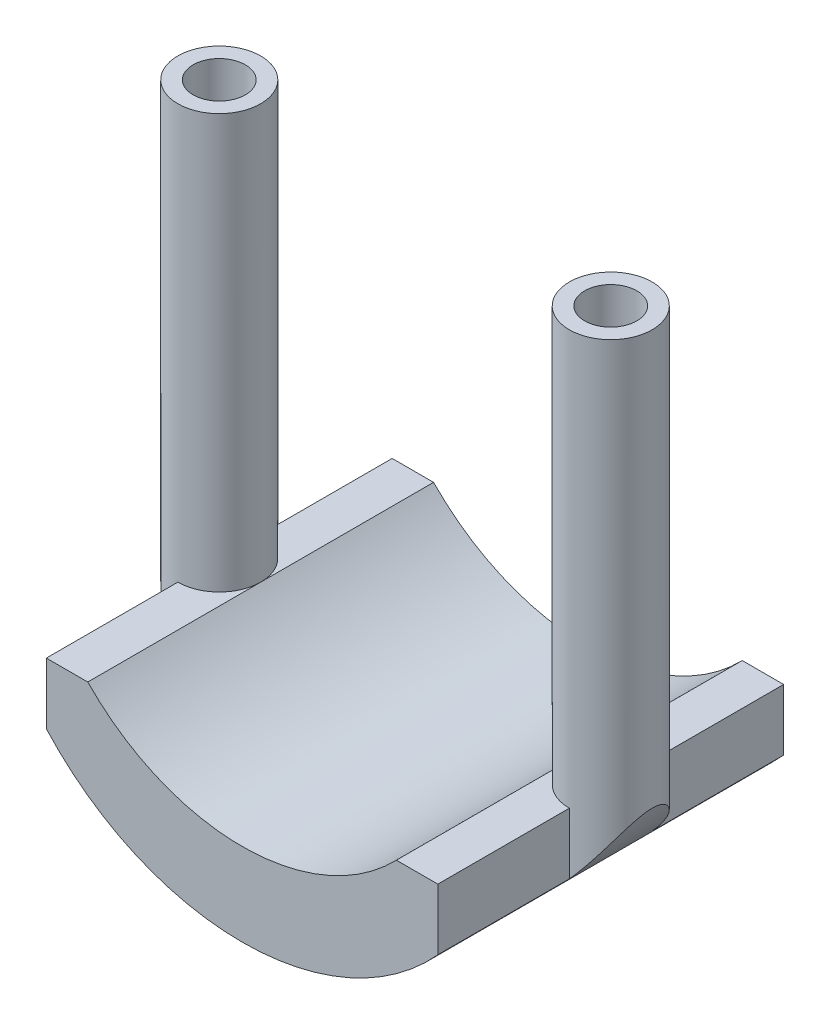
ISO-10303-21;
HEADER;
FILE_DESCRIPTION(('STEP AP214'),'2;1');
FILE_NAME('part.step','',(''),(''),'','','');
FILE_SCHEMA(('AUTOMOTIVE_DESIGN { 1 0 10303 214 1 1 1 1 }'));
ENDSEC;
DATA;
#1=APPLICATION_CONTEXT('core data for automotive mechanical design processes');
#2=APPLICATION_PROTOCOL_DEFINITION('international standard','automotive_design',2000,#1);
#3=PRODUCT_CONTEXT('',#1,'mechanical');
#4=PRODUCT('Part','Part','',(#3));
#5=PRODUCT_RELATED_PRODUCT_CATEGORY('part','',(#4));
#6=PRODUCT_DEFINITION_FORMATION('','',#4);
#7=PRODUCT_DEFINITION_CONTEXT('part definition',#1,'design');
#8=PRODUCT_DEFINITION('design','',#6,#7);
#9=PRODUCT_DEFINITION_SHAPE('','',#8);
#10=(LENGTH_UNIT() NAMED_UNIT(*) SI_UNIT(.MILLI.,.METRE.));
#11=(NAMED_UNIT(*) PLANE_ANGLE_UNIT() SI_UNIT($,.RADIAN.));
#12=(NAMED_UNIT(*) SI_UNIT($,.STERADIAN.) SOLID_ANGLE_UNIT());
#13=UNCERTAINTY_MEASURE_WITH_UNIT(LENGTH_MEASURE(1.E-05),#10,'distance_accuracy_value','');
#14=(GEOMETRIC_REPRESENTATION_CONTEXT(3) GLOBAL_UNCERTAINTY_ASSIGNED_CONTEXT((#13)) GLOBAL_UNIT_ASSIGNED_CONTEXT((#10,
#11,#12)) REPRESENTATION_CONTEXT('',''));
#15=CARTESIAN_POINT('',(0.,0.,0.));
#16=DIRECTION('',(0.,0.,1.));
#17=DIRECTION('',(1.,0.,0.));
#18=AXIS2_PLACEMENT_3D('',#15,#16,#17);
#19=CARTESIAN_POINT('',(-15.,0.,0.));
#20=DIRECTION('',(0.,-1.,0.));
#21=DIRECTION('',(0.,0.,-1.));
#22=AXIS2_PLACEMENT_3D('',#19,#20,#21);
#23=PLANE('',#22);
#24=DIRECTION('',(1.,0.,0.));
#25=VECTOR('',#24,1.);
#26=CARTESIAN_POINT('',(15.,0.,-13.25));
#27=LINE('',#26,#25);
#28=CARTESIAN_POINT('',(11.825,0.,-13.25));
#29=VERTEX_POINT('',#28);
#30=CARTESIAN_POINT('',(15.,0.,-13.25));
#31=VERTEX_POINT('',#30);
#32=EDGE_CURVE('E141',#29,#31,#27,.T.);
#33=ORIENTED_EDGE('',*,*,#32,.F.);
#34=DIRECTION('',(0.,0.,1.));
#35=VECTOR('',#34,1.);
#36=CARTESIAN_POINT('',(11.825,0.,-13.250025));
#37=LINE('',#36,#35);
#38=CARTESIAN_POINT('',(11.825,0.,0.));
#39=VERTEX_POINT('',#38);
#40=EDGE_CURVE('E12',#29,#39,#37,.T.);
#41=ORIENTED_EDGE('',*,*,#40,.T.);
#42=CARTESIAN_POINT('',(15.,0.,0.));
#43=DIRECTION('',(0.,-1.,0.));
#44=DIRECTION('',(0.,0.,-1.));
#45=AXIS2_PLACEMENT_3D('',#42,#43,#44);
#46=CIRCLE('',#45,3.175);
#47=CARTESIAN_POINT('',(15.,0.,-3.17500000000001));
#48=VERTEX_POINT('',#47);
#49=EDGE_CURVE('E227',#48,#39,#46,.F.);
#50=ORIENTED_EDGE('',*,*,#49,.F.);
#51=DIRECTION('',(0.,0.,1.));
#52=VECTOR('',#51,1.);
#53=CARTESIAN_POINT('',(15.,0.,-3.17500000000001));
#54=LINE('',#53,#52);
#55=EDGE_CURVE('E149',#31,#48,#54,.T.);
#56=ORIENTED_EDGE('',*,*,#55,.F.);
#57=EDGE_LOOP('',(#33,#41,#50,#56));
#58=FACE_BOUND('',#57,.T.);
#59=ADVANCED_FACE('F51',(#58),#23,.F.);
#60=CARTESIAN_POINT('',(15.,0.,3.175));
#61=VERTEX_POINT('',#60);
#62=EDGE_CURVE('E186',#39,#61,#46,.F.);
#63=ORIENTED_EDGE('',*,*,#62,.F.);
#64=CARTESIAN_POINT('',(11.825,0.,13.25));
#65=VERTEX_POINT('',#64);
#66=EDGE_CURVE('E62',#39,#65,#37,.T.);
#67=ORIENTED_EDGE('',*,*,#66,.T.);
#68=DIRECTION('',(-1.,0.,0.));
#69=VECTOR('',#68,1.);
#70=CARTESIAN_POINT('',(15.,0.,13.25));
#71=LINE('',#70,#69);
#72=CARTESIAN_POINT('',(15.,0.,13.25));
#73=VERTEX_POINT('',#72);
#74=EDGE_CURVE('E163',#73,#65,#71,.T.);
#75=ORIENTED_EDGE('',*,*,#74,.F.);
#76=DIRECTION('',(0.,0.,1.));
#77=VECTOR('',#76,1.);
#78=CARTESIAN_POINT('',(15.,0.,3.175));
#79=LINE('',#78,#77);
#80=EDGE_CURVE('E159',#61,#73,#79,.T.);
#81=ORIENTED_EDGE('',*,*,#80,.F.);
#82=EDGE_LOOP('',(#63,#67,#75,#81));
#83=FACE_BOUND('',#82,.T.);
#84=ADVANCED_FACE('F209',(#83),#23,.F.);
#85=CARTESIAN_POINT('',(-11.825,0.,13.25));
#86=VERTEX_POINT('',#85);
#87=CARTESIAN_POINT('',(-15.,0.,13.25));
#88=VERTEX_POINT('',#87);
#89=EDGE_CURVE('E162',#86,#88,#71,.T.);
#90=ORIENTED_EDGE('',*,*,#89,.F.);
#91=DIRECTION('',(0.,0.,1.));
#92=VECTOR('',#91,1.);
#93=CARTESIAN_POINT('',(-11.825,0.,-13.250025));
#94=LINE('',#93,#92);
#95=CARTESIAN_POINT('',(-11.825,0.,0.));
#96=VERTEX_POINT('',#95);
#97=EDGE_CURVE('E129',#86,#96,#94,.F.);
#98=ORIENTED_EDGE('',*,*,#97,.T.);
#99=CARTESIAN_POINT('',(-15.,0.,0.));
#100=DIRECTION('',(0.,1.,0.));
#101=DIRECTION('',(0.,0.,1.));
#102=AXIS2_PLACEMENT_3D('',#99,#100,#101);
#103=CIRCLE('',#102,3.175);
#104=CARTESIAN_POINT('',(-15.,0.,3.175));
#105=VERTEX_POINT('',#104);
#106=EDGE_CURVE('E187',#105,#96,#103,.T.);
#107=ORIENTED_EDGE('',*,*,#106,.F.);
#108=DIRECTION('',(0.,0.,-1.));
#109=VECTOR('',#108,1.);
#110=CARTESIAN_POINT('',(-15.,0.,3.175));
#111=LINE('',#110,#109);
#112=EDGE_CURVE('E166',#88,#105,#111,.T.);
#113=ORIENTED_EDGE('',*,*,#112,.F.);
#114=EDGE_LOOP('',(#90,#98,#107,#113));
#115=FACE_BOUND('',#114,.T.);
#116=ADVANCED_FACE('F296',(#115),#23,.F.);
#117=CARTESIAN_POINT('',(-15.,31.75,0.));
#118=DIRECTION('',(0.,-1.,0.));
#119=DIRECTION('',(0.,0.,-1.));
#120=AXIS2_PLACEMENT_3D('',#117,#118,#119);
#121=CYLINDRICAL_SURFACE('',#120,3.175);
#122=CARTESIAN_POINT('',(-15.,31.75,0.));
#123=DIRECTION('',(0.,1.,0.));
#124=DIRECTION('',(0.,0.,1.));
#125=AXIS2_PLACEMENT_3D('',#122,#123,#124);
#126=CIRCLE('',#125,3.175);
#127=CARTESIAN_POINT('',(-15.,31.75,3.175));
#128=VERTEX_POINT('',#127);
#129=EDGE_CURVE('E183',#128,#128,#126,.T.);
#130=ORIENTED_EDGE('',*,*,#129,.F.);
#131=EDGE_LOOP('',(#130));
#132=FACE_BOUND('',#131,.T.);
#133=CARTESIAN_POINT('',(-15.,-4.69251218639161,-3.175));
#134=CARTESIAN_POINT('',(-14.8205033811229,-4.89092476869645,-3.17500426324024));
#135=CARTESIAN_POINT('',(-14.6369237073661,-5.08590920938369,-3.15981877218464));
#136=CARTESIAN_POINT('',(-14.2649875373379,-5.46567546884102,-3.09451581072287));
#137=CARTESIAN_POINT('',(-14.0766289421228,-5.6504526872134,-3.04438272584182));
#138=CARTESIAN_POINT('',(-13.7279860773095,-5.9797490289322,-2.91410960622013));
#139=CARTESIAN_POINT('',(-13.5675765249512,-6.12622800863299,-2.83934980518906));
#140=CARTESIAN_POINT('',(-13.2529145670275,-6.404880166803,-2.6573058387837));
#141=CARTESIAN_POINT('',(-13.0986537078819,-6.53707344669857,-2.55006820332544));
#142=CARTESIAN_POINT('',(-12.8317513137313,-6.7595606963644,-2.32458781779786));
#143=CARTESIAN_POINT('',(-12.7167765309544,-6.85304060280956,-2.21232434869968));
#144=CARTESIAN_POINT('',(-12.5548804443534,-6.9821109527208,-2.027009530444));
#145=CARTESIAN_POINT('',(-12.5026532417396,-7.02329348540627,-1.96238238996577));
#146=CARTESIAN_POINT('',(-12.4024265540511,-7.1015938282898,-1.82764242802179));
#147=CARTESIAN_POINT('',(-12.3544251428567,-7.13871349224414,-1.75753213358982));
#148=CARTESIAN_POINT('',(-12.2629417638018,-7.20887048923795,-1.61140859624324));
#149=CARTESIAN_POINT('',(-12.2195061825062,-7.24186646614424,-1.53534634647773));
#150=CARTESIAN_POINT('',(-12.1384435315487,-7.30299922696252,-1.37837439780977));
#151=CARTESIAN_POINT('',(-12.1008133149241,-7.33113864449968,-1.29746735841784));
#152=CARTESIAN_POINT('',(-12.0320664757083,-7.38223799204299,-1.13140078348071));
#153=CARTESIAN_POINT('',(-12.0009468591754,-7.40520030315416,-1.04624322497778));
#154=CARTESIAN_POINT('',(-11.945846091496,-7.44566949537515,-0.872398070225833));
#155=CARTESIAN_POINT('',(-11.9218635533182,-7.46317743652713,-0.78371116367929));
#156=CARTESIAN_POINT('',(-11.8845421817276,-7.49033673552369,-0.617029782914338));
#157=CARTESIAN_POINT('',(-11.8701534457801,-7.50076733433465,-0.53939519740451));
#158=CARTESIAN_POINT('',(-11.8471667145353,-7.51740294750085,-0.382794605329069));
#159=CARTESIAN_POINT('',(-11.8385706496093,-7.52360655324478,-0.303828163907767));
#160=CARTESIAN_POINT('',(-11.8273337077117,-7.53171209312102,-0.145318138153976));
#161=CARTESIAN_POINT('',(-11.8246875813389,-7.53361781911112,-0.0657751247271536));
#162=CARTESIAN_POINT('',(-11.8253719864472,-7.5331241145751,0.0932799754835464));
#163=CARTESIAN_POINT('',(-11.8287046487468,-7.5307231491599,0.172792041135653));
#164=CARTESIAN_POINT('',(-11.8465723858494,-7.51783426402546,0.397018247582718));
#165=CARTESIAN_POINT('',(-11.8681181184742,-7.50228202991565,0.540973547893816));
#166=CARTESIAN_POINT('',(-11.9299715189903,-7.45728323858153,0.822407488534177));
#167=CARTESIAN_POINT('',(-11.9702781955919,-7.42783741546478,0.959886470636185));
#168=CARTESIAN_POINT('',(-12.0684834361971,-7.3552855312179,1.22783943484221));
#169=CARTESIAN_POINT('',(-12.1267152371879,-7.31191997935615,1.35812026041384));
#170=CARTESIAN_POINT('',(-12.2576236262407,-7.2130276233496,1.60614187670359));
#171=CARTESIAN_POINT('',(-12.3303043219782,-7.15749736044098,1.72387908674494));
#172=CARTESIAN_POINT('',(-12.4952932166363,-7.02932697225239,1.9569170193262));
#173=CARTESIAN_POINT('',(-12.5888598831978,-6.95550392285766,2.07067076308024));
#174=CARTESIAN_POINT('',(-12.7860005890668,-6.79673239386281,2.2802583795799));
#175=CARTESIAN_POINT('',(-12.8895811246299,-6.71177667934167,2.37608049969669));
#176=CARTESIAN_POINT('',(-13.1544595838743,-6.48965438464711,2.59153553302787));
#177=CARTESIAN_POINT('',(-13.3196812880768,-6.34694107425303,2.70065842301775));
#178=CARTESIAN_POINT('',(-13.6559414223191,-6.04607046543018,2.88285682505669));
#179=CARTESIAN_POINT('',(-13.8269908784351,-5.88788269547763,2.95585942706256));
#180=CARTESIAN_POINT('',(-14.1144221526229,-5.61233945122504,3.05146922752589));
#181=CARTESIAN_POINT('',(-14.2309229031751,-5.49796072151903,3.08271748716632));
#182=CARTESIAN_POINT('',(-14.4625588452152,-5.26488858576289,3.13142043063921));
#183=CARTESIAN_POINT('',(-14.5776935377711,-5.14619366394768,3.14887021880867));
#184=CARTESIAN_POINT('',(-14.8057106660033,-4.90524060674489,3.17112263365381));
#185=CARTESIAN_POINT('',(-14.9185898140847,-4.7829778303132,3.17590797066095));
#186=CARTESIAN_POINT('',(-15.1412247598072,-4.5357795895864,3.17381030787641));
#187=CARTESIAN_POINT('',(-15.2509806065437,-4.41084416735687,3.16692749160002));
#188=CARTESIAN_POINT('',(-15.5008752856459,-4.11923373794164,3.13849782067385));
#189=CARTESIAN_POINT('',(-15.6396957096708,-3.95180607196426,3.11301513444598));
#190=CARTESIAN_POINT('',(-15.9102628046364,-3.61467642308511,3.04491703578205));
#191=CARTESIAN_POINT('',(-16.0420064633575,-3.44497350953356,3.00229439222408));
#192=CARTESIAN_POINT('',(-16.2978563651724,-3.10452476896611,2.90088627166143));
#193=CARTESIAN_POINT('',(-16.4219588707244,-2.93377847578345,2.84209296071367));
#194=CARTESIAN_POINT('',(-16.6619380784916,-2.59274040987533,2.70877000035546));
#195=CARTESIAN_POINT('',(-16.777818485819,-2.42244846613229,2.63424749992075));
#196=CARTESIAN_POINT('',(-16.961819868065,-2.14324322049304,2.49800123741523));
#197=CARTESIAN_POINT('',(-17.0324635904153,-2.03370417671064,2.44092421325364));
#198=CARTESIAN_POINT('',(-17.1698703571187,-1.81616621523441,2.31963136312153));
#199=CARTESIAN_POINT('',(-17.236634170642,-1.70816699550488,2.25541695949912));
#200=CARTESIAN_POINT('',(-17.3658686670049,-1.49478141017556,2.11945077066519));
#201=CARTESIAN_POINT('',(-17.4283488510762,-1.38938961683399,2.04771662224494));
#202=CARTESIAN_POINT('',(-17.548738128669,-1.18221739723897,1.89577234298333));
#203=CARTESIAN_POINT('',(-17.6066497009302,-1.08043502939408,1.81556686435931));
#204=CARTESIAN_POINT('',(-17.719514319049,-0.878228260439077,1.64196045064789));
#205=CARTESIAN_POINT('',(-17.7742524291879,-0.778025963616148,1.54815654635292));
#206=CARTESIAN_POINT('',(-17.8768276528085,-0.586746248942451,1.348012285463));
#207=CARTESIAN_POINT('',(-17.9246670595403,-0.495665801918517,1.24167611627272));
#208=CARTESIAN_POINT('',(-18.000678509853,-0.348641139020262,1.04166500085582));
#209=CARTESIAN_POINT('',(-18.0308120115437,-0.289518658796541,0.951112713723735));
#210=CARTESIAN_POINT('',(-18.0840456222686,-0.18404440897729,0.760908415934263));
#211=CARTESIAN_POINT('',(-18.107161326205,-0.137664345414025,0.661277231025693));
#212=CARTESIAN_POINT('',(-18.1394432005674,-0.0724879765660675,0.480283409288171));
#213=CARTESIAN_POINT('',(-18.1506645378214,-0.0496716142670397,0.400758022979554));
#214=CARTESIAN_POINT('',(-18.1670676004247,-0.0162426867323507,0.238585926454408));
#215=CARTESIAN_POINT('',(-18.17225680337,-0.00561501229054437,0.155943212121486));
#216=CARTESIAN_POINT('',(-18.1760761173387,0.00220219981137142,-0.0104469158348688));
#217=CARTESIAN_POINT('',(-18.1746827553842,-0.000656353448610196,-0.0941972192502418));
#218=CARTESIAN_POINT('',(-18.16544000723,-0.0195522865256846,-0.259841463478308));
#219=CARTESIAN_POINT('',(-18.1575848940966,-0.0356013568493288,-0.341733691327889));
#220=CARTESIAN_POINT('',(-18.133653492111,-0.0842078295487032,-0.520344882541793));
#221=CARTESIAN_POINT('',(-18.1160804399877,-0.119755580327204,-0.6160330078488));
#222=CARTESIAN_POINT('',(-18.074052277734,-0.203890752980378,-0.799861466851044));
#223=CARTESIAN_POINT('',(-18.0495820061886,-0.252506890655784,-0.887984608181645));
#224=CARTESIAN_POINT('',(-18.0000627397135,-0.349696696452959,-1.04192103325311));
#225=CARTESIAN_POINT('',(-17.9758512854762,-0.396813309524851,-1.10895189638106));
#226=CARTESIAN_POINT('',(-17.9244331569286,-0.495809912626401,-1.23820457381986));
#227=CARTESIAN_POINT('',(-17.8972243980809,-0.547693213531406,-1.30042298937035));
#228=CARTESIAN_POINT('',(-17.8117324694039,-0.708855937807456,-1.48073084699326));
#229=CARTESIAN_POINT('',(-17.7496634858842,-0.823489610870968,-1.59223859568543));
#230=CARTESIAN_POINT('',(-17.620033122947,-1.05695755896059,-1.79728606175843));
#231=CARTESIAN_POINT('',(-17.552719928952,-1.17552918377591,-1.89129656479072));
#232=CARTESIAN_POINT('',(-17.4118838203927,-1.41754426300371,-2.06789648428308));
#233=CARTESIAN_POINT('',(-17.338355428152,-1.54099196274834,-2.15047565324453));
#234=CARTESIAN_POINT('',(-17.1856472740962,-1.79102523920031,-2.30552025789266));
#235=CARTESIAN_POINT('',(-17.1064581091932,-1.91761579768952,-2.37796824568908));
#236=CARTESIAN_POINT('',(-16.9429526002597,-2.17247915209529,-2.5133273814063));
#237=CARTESIAN_POINT('',(-16.8586379518092,-2.30075138079672,-2.57624165941052));
#238=CARTESIAN_POINT('',(-16.6766496670621,-2.57071074927785,-2.69863708579866));
#239=CARTESIAN_POINT('',(-16.5784755365202,-2.71248461247264,-2.75718293357318));
#240=CARTESIAN_POINT('',(-16.3765070671643,-2.99616466806827,-2.86336666702282));
#241=CARTESIAN_POINT('',(-16.2727114129249,-3.13807088373816,-2.91100198590087));
#242=CARTESIAN_POINT('',(-16.0601001796041,-3.42080740580612,-2.99496873756423));
#243=CARTESIAN_POINT('',(-15.9512996601377,-3.56163962157948,-3.03133182200759));
#244=CARTESIAN_POINT('',(-15.7287721570088,-3.84185970056326,-3.09238099734894));
#245=CARTESIAN_POINT('',(-15.6150474147963,-3.98124818587176,-3.1170723413453));
#246=CARTESIAN_POINT('',(-15.4179881678968,-4.21625160040424,-3.14843563002142));
#247=CARTESIAN_POINT('',(-15.3358081261236,-4.31241537437699,-3.15829421655108));
#248=CARTESIAN_POINT('',(-15.1693924718654,-4.50348118123944,-3.17157721664858));
#249=CARTESIAN_POINT('',(-15.0851557198618,-4.59838246750603,-3.17499797745889));
#250=CARTESIAN_POINT('',(-15.,-4.69251218639161,-3.175));
#251=B_SPLINE_CURVE_WITH_KNOTS('',3,(#133,#134,#135,#136,#137,#138,#139,#140,#141,#142,#143,
#144,#145,#146,#147,#148,#149,#150,#151,#152,#153,#154,#155,#156,#157,#158,#159,#160,#161,#162,
#163,#164,#165,#166,#167,#168,#169,#170,#171,#172,#173,#174,#175,#176,#177,#178,#179,#180,#181,
#182,#183,#184,#185,#186,#187,#188,#189,#190,#191,#192,#193,#194,#195,#196,#197,#198,#199,#200,
#201,#202,#203,#204,#205,#206,#207,#208,#209,#210,#211,#212,#213,#214,#215,#216,#217,#218,#219,
#220,#221,#222,#223,#224,#225,#226,#227,#228,#229,#230,#231,#232,#233,#234,#235,#236,#237,#238,
#239,#240,#241,#242,#243,#244,#245,#246,#247,#248,#249,#250),.UNSPECIFIED.,.T.,.F.,(4,2,2,2,2,2,
2,2,2,2,2,2,2,2,2,2,2,2,2,2,2,2,2,2,2,2,2,2,2,2,2,2,2,2,2,2,2,2,2,2,2,2,2,2,2,2,2,2,2,2,2,2,2,2,
2,2,2,2,4),(0.,0.802407373998286,1.60517349106174,2.29198612768376,2.9778194082931,
3.53311884003804,3.81103936161806,4.08883254370098,4.36921967461288,4.64945427557223,
4.92955972418818,5.20961070105196,5.44821826109419,5.68690529634162,5.92538166446762,
6.16394304158794,6.60086941387879,7.03777270249896,7.48334632921596,7.92904680965181,
8.4214324061908,8.9141395972197,9.64234455290856,10.3720134789014,10.8700776177538,
11.3683183893217,11.8672390154304,12.3661517946489,13.0222031118585,13.6785314993284,
14.3351784094106,14.9915275112103,15.4181996153673,15.844786843576,16.2703950387549,
16.6957707052929,17.1383810890498,17.5808440004908,17.916697398235,18.2517989079104,
18.5012725803997,18.7504366677055,19.0004899264488,19.2507650419654,19.5597766960571,
19.8694729868995,20.1254191516956,20.381544456937,20.8946676063151,21.3908928521297,
21.8875600923608,22.3850724261382,22.8824210623694,23.4283400634636,23.9743873651471,
24.5188872167513,25.0631417715148,25.4435993094566,25.8242726501731),.UNSPECIFIED.);
#252=CARTESIAN_POINT('',(-15.,-4.69251218639161,3.175));
#253=VERTEX_POINT('',#252);
#254=CARTESIAN_POINT('',(-15.,-4.69251218639161,-3.175));
#255=VERTEX_POINT('',#254);
#256=EDGE_CURVE('E237',#253,#255,#251,.T.);
#257=ORIENTED_EDGE('',*,*,#256,.F.);
#258=DIRECTION('',(0.,1.,0.));
#259=VECTOR('',#258,1.);
#260=CARTESIAN_POINT('',(-15.,-20.,3.175));
#261=LINE('',#260,#259);
#262=EDGE_CURVE('E171',#253,#105,#261,.T.);
#263=ORIENTED_EDGE('',*,*,#262,.T.);
#264=ORIENTED_EDGE('',*,*,#106,.T.);
#265=CARTESIAN_POINT('',(-15.,0.,-3.175));
#266=VERTEX_POINT('',#265);
#267=EDGE_CURVE('E190',#96,#266,#103,.T.);
#268=ORIENTED_EDGE('',*,*,#267,.T.);
#269=DIRECTION('',(0.,1.,0.));
#270=VECTOR('',#269,1.);
#271=CARTESIAN_POINT('',(-15.,-20.,-3.175));
#272=LINE('',#271,#270);
#273=EDGE_CURVE('E182',#255,#266,#272,.T.);
#274=ORIENTED_EDGE('',*,*,#273,.F.);
#275=EDGE_LOOP('',(#257,#263,#264,#268,#274));
#276=FACE_BOUND('',#275,.T.);
#277=ADVANCED_FACE('F53',(#132,#276),#121,.T.);
#278=CARTESIAN_POINT('',(-15.,-20.,-3.175));
#279=DIRECTION('',(1.,0.,0.));
#280=DIRECTION('',(0.,0.,-1.));
#281=AXIS2_PLACEMENT_3D('',#278,#279,#280);
#282=PLANE('',#281);
#283=DIRECTION('',(0.,0.,1.));
#284=VECTOR('',#283,1.);
#285=CARTESIAN_POINT('',(-15.,-4.69251218639162,-13.250025));
#286=LINE('',#285,#284);
#287=CARTESIAN_POINT('',(-15.,-4.69251218639162,-13.25));
#288=VERTEX_POINT('',#287);
#289=EDGE_CURVE('E247',#255,#288,#286,.F.);
#290=ORIENTED_EDGE('',*,*,#289,.F.);
#291=ORIENTED_EDGE('',*,*,#273,.T.);
#292=DIRECTION('',(0.,0.,-1.));
#293=VECTOR('',#292,1.);
#294=CARTESIAN_POINT('',(-15.,0.,-3.175));
#295=LINE('',#294,#293);
#296=CARTESIAN_POINT('',(-15.,0.,-13.25));
#297=VERTEX_POINT('',#296);
#298=EDGE_CURVE('E150',#266,#297,#295,.T.);
#299=ORIENTED_EDGE('',*,*,#298,.T.);
#300=DIRECTION('',(0.,1.,0.));
#301=VECTOR('',#300,1.);
#302=CARTESIAN_POINT('',(-15.,-20.,-13.25));
#303=LINE('',#302,#301);
#304=EDGE_CURVE('E180',#288,#297,#303,.T.);
#305=ORIENTED_EDGE('',*,*,#304,.F.);
#306=EDGE_LOOP('',(#290,#291,#299,#305));
#307=FACE_BOUND('',#306,.T.);
#308=ADVANCED_FACE('F283',(#307),#282,.F.);
#309=CARTESIAN_POINT('',(15.,-20.,-13.25));
#310=DIRECTION('',(0.,0.,1.));
#311=DIRECTION('',(1.,0.,0.));
#312=AXIS2_PLACEMENT_3D('',#309,#310,#311);
#313=PLANE('',#312);
#314=CARTESIAN_POINT('',(-11.825,0.,-13.25));
#315=VERTEX_POINT('',#314);
#316=EDGE_CURVE('E144',#297,#315,#27,.T.);
#317=ORIENTED_EDGE('',*,*,#316,.T.);
#318=CARTESIAN_POINT('',(0.,11.4830625,-13.25));
#319=DIRECTION('',(0.,0.,1.));
#320=DIRECTION('',(1.,0.,0.));
#321=AXIS2_PLACEMENT_3D('',#318,#319,#320);
#322=CIRCLE('',#321,16.4830625);
#323=EDGE_CURVE('E56',#315,#29,#322,.T.);
#324=ORIENTED_EDGE('',*,*,#323,.T.);
#325=ORIENTED_EDGE('',*,*,#32,.T.);
#326=DIRECTION('',(0.,1.,0.));
#327=VECTOR('',#326,1.);
#328=CARTESIAN_POINT('',(15.,-20.,-13.25));
#329=LINE('',#328,#327);
#330=CARTESIAN_POINT('',(15.,-4.69251218639162,-13.25));
#331=VERTEX_POINT('',#330);
#332=EDGE_CURVE('E178',#331,#31,#329,.T.);
#333=ORIENTED_EDGE('',*,*,#332,.F.);
#334=CARTESIAN_POINT('',(0.,8.87700991189428,-13.25));
#335=DIRECTION('',(0.,0.,1.));
#336=DIRECTION('',(1.,0.,0.));
#337=AXIS2_PLACEMENT_3D('',#334,#335,#336);
#338=CIRCLE('',#337,20.2270099118943);
#339=EDGE_CURVE('E249',#288,#331,#338,.T.);
#340=ORIENTED_EDGE('',*,*,#339,.F.);
#341=ORIENTED_EDGE('',*,*,#304,.T.);
#342=EDGE_LOOP('',(#317,#324,#325,#333,#340,#341));
#343=FACE_BOUND('',#342,.T.);
#344=ADVANCED_FACE('F139',(#343),#313,.F.);
#345=CARTESIAN_POINT('',(15.,-20.,-3.17500000000001));
#346=DIRECTION('',(-1.,0.,0.));
#347=DIRECTION('',(0.,0.,1.));
#348=AXIS2_PLACEMENT_3D('',#345,#346,#347);
#349=PLANE('',#348);
#350=DIRECTION('',(0.,0.,1.));
#351=VECTOR('',#350,1.);
#352=CARTESIAN_POINT('',(15.,-4.69251218639162,-13.250025));
#353=LINE('',#352,#351);
#354=CARTESIAN_POINT('',(15.,-4.69251218639162,-3.17500000000001));
#355=VERTEX_POINT('',#354);
#356=EDGE_CURVE('E270',#331,#355,#353,.T.);
#357=ORIENTED_EDGE('',*,*,#356,.F.);
#358=ORIENTED_EDGE('',*,*,#332,.T.);
#359=ORIENTED_EDGE('',*,*,#55,.T.);
#360=DIRECTION('',(0.,1.,0.));
#361=VECTOR('',#360,1.);
#362=CARTESIAN_POINT('',(15.,-20.,-3.17500000000001));
#363=LINE('',#362,#361);
#364=EDGE_CURVE('E176',#355,#48,#363,.T.);
#365=ORIENTED_EDGE('',*,*,#364,.F.);
#366=EDGE_LOOP('',(#357,#358,#359,#365));
#367=FACE_BOUND('',#366,.T.);
#368=ADVANCED_FACE('F275',(#367),#349,.F.);
#369=CARTESIAN_POINT('',(15.,-20.,0.));
#370=DIRECTION('',(0.,1.,0.));
#371=DIRECTION('',(0.,0.,1.));
#372=AXIS2_PLACEMENT_3D('',#369,#370,#371);
#373=CYLINDRICAL_SURFACE('',#372,3.175);
#374=CARTESIAN_POINT('',(15.,31.75,0.));
#375=DIRECTION('',(0.,1.,0.));
#376=DIRECTION('',(0.,0.,1.));
#377=AXIS2_PLACEMENT_3D('',#374,#375,#376);
#378=CIRCLE('',#377,3.175);
#379=CARTESIAN_POINT('',(15.,31.75,3.175));
#380=VERTEX_POINT('',#379);
#381=EDGE_CURVE('E153',#380,#380,#378,.T.);
#382=ORIENTED_EDGE('',*,*,#381,.F.);
#383=EDGE_LOOP('',(#382));
#384=FACE_BOUND('',#383,.T.);
#385=CARTESIAN_POINT('',(15.,-4.69251218639162,3.175));
#386=CARTESIAN_POINT('',(14.8205033811229,-4.89092476869646,3.17500426324023));
#387=CARTESIAN_POINT('',(14.6369237073661,-5.0859092093837,3.15981877218464));
#388=CARTESIAN_POINT('',(14.2649875373379,-5.46567546884103,3.09451581072286));
#389=CARTESIAN_POINT('',(14.0766289421228,-5.65045268721341,3.04438272584182));
#390=CARTESIAN_POINT('',(13.7279860773095,-5.97974902893221,2.91410960622013));
#391=CARTESIAN_POINT('',(13.5675765249512,-6.126228008633,2.83934980518906));
#392=CARTESIAN_POINT('',(13.2529145670275,-6.40488016680301,2.65730583878369));
#393=CARTESIAN_POINT('',(13.0986537078819,-6.53707344669858,2.55006820332544));
#394=CARTESIAN_POINT('',(12.8317513137313,-6.75956069636441,2.32458781779785));
#395=CARTESIAN_POINT('',(12.7167765309544,-6.85304060280957,2.21232434869967));
#396=CARTESIAN_POINT('',(12.5548804443534,-6.98211095272081,2.02700953044399));
#397=CARTESIAN_POINT('',(12.5026532417396,-7.02329348540628,1.96238238996576));
#398=CARTESIAN_POINT('',(12.4024265540511,-7.10159382828981,1.82764242802178));
#399=CARTESIAN_POINT('',(12.3544251428567,-7.13871349224415,1.75753213358981));
#400=CARTESIAN_POINT('',(12.2629417638018,-7.20887048923796,1.61140859624323));
#401=CARTESIAN_POINT('',(12.2195061825062,-7.24186646614425,1.53534634647772));
#402=CARTESIAN_POINT('',(12.1384435315487,-7.30299922696253,1.37837439780976));
#403=CARTESIAN_POINT('',(12.1008133149241,-7.33113864449969,1.29746735841783));
#404=CARTESIAN_POINT('',(12.0320664757083,-7.382237992043,1.1314007834807));
#405=CARTESIAN_POINT('',(12.0009468591754,-7.40520030315418,1.04624322497777));
#406=CARTESIAN_POINT('',(11.945846091496,-7.44566949537516,0.872398070225823));
#407=CARTESIAN_POINT('',(11.9218635533182,-7.46317743652715,0.78371116367928));
#408=CARTESIAN_POINT('',(11.8845421817276,-7.49033673552369,0.617029782914327));
#409=CARTESIAN_POINT('',(11.8701534457801,-7.50076733433465,0.539395197404498));
#410=CARTESIAN_POINT('',(11.8471667145353,-7.51740294750085,0.382794605329057));
#411=CARTESIAN_POINT('',(11.8385706496094,-7.52360655324479,0.303828163907755));
#412=CARTESIAN_POINT('',(11.8273337077117,-7.53171209312103,0.145318138153964));
#413=CARTESIAN_POINT('',(11.8246875813389,-7.53361781911113,0.0657751247271415));
#414=CARTESIAN_POINT('',(11.8253719864472,-7.53312411457511,-0.0932799754835585));
#415=CARTESIAN_POINT('',(11.8287046487468,-7.5307231491599,-0.172792041135665));
#416=CARTESIAN_POINT('',(11.8465723858494,-7.51783426402546,-0.397018247582731));
#417=CARTESIAN_POINT('',(11.8681181184742,-7.50228202991565,-0.540973547893829));
#418=CARTESIAN_POINT('',(11.9299715189903,-7.45728323858154,-0.82240748853419));
#419=CARTESIAN_POINT('',(11.9702781955919,-7.42783741546478,-0.959886470636197));
#420=CARTESIAN_POINT('',(12.0684834361971,-7.3552855312179,-1.22783943484223));
#421=CARTESIAN_POINT('',(12.1267152371879,-7.31191997935616,-1.35812026041385));
#422=CARTESIAN_POINT('',(12.2576236262407,-7.2130276233496,-1.60614187670361));
#423=CARTESIAN_POINT('',(12.3303043219782,-7.15749736044099,-1.72387908674495));
#424=CARTESIAN_POINT('',(12.4952932166363,-7.0293269722524,-1.95691701932621));
#425=CARTESIAN_POINT('',(12.5888598831979,-6.95550392285766,-2.07067076308025));
#426=CARTESIAN_POINT('',(12.7860005890668,-6.79673239386281,-2.28025837957991));
#427=CARTESIAN_POINT('',(12.8895811246299,-6.71177667934167,-2.3760804996967));
#428=CARTESIAN_POINT('',(13.1544595838743,-6.48965438464711,-2.59153553302788));
#429=CARTESIAN_POINT('',(13.3196812880768,-6.34694107425303,-2.70065842301776));
#430=CARTESIAN_POINT('',(13.6559414223191,-6.04607046543019,-2.8828568250567));
#431=CARTESIAN_POINT('',(13.8269908784351,-5.88788269547764,-2.95585942706257));
#432=CARTESIAN_POINT('',(14.1144221526229,-5.61233945122505,-3.05146922752589));
#433=CARTESIAN_POINT('',(14.2309229031751,-5.49796072151903,-3.08271748716633));
#434=CARTESIAN_POINT('',(14.4625588452152,-5.26488858576289,-3.13142043063921));
#435=CARTESIAN_POINT('',(14.5776935377711,-5.14619366394768,-3.14887021880868));
#436=CARTESIAN_POINT('',(14.8057106660034,-4.9052406067449,-3.17112263365381));
#437=CARTESIAN_POINT('',(14.9185898140847,-4.7829778303132,-3.17590797066096));
#438=CARTESIAN_POINT('',(15.1412247598072,-4.53577958958641,-3.17381030787642));
#439=CARTESIAN_POINT('',(15.2509806065437,-4.41084416735688,-3.16692749160003));
#440=CARTESIAN_POINT('',(15.5008752856459,-4.11923373794165,-3.13849782067386));
#441=CARTESIAN_POINT('',(15.6396957096708,-3.95180607196427,-3.11301513444599));
#442=CARTESIAN_POINT('',(15.9102628046364,-3.61467642308512,-3.04491703578205));
#443=CARTESIAN_POINT('',(16.0420064633575,-3.44497350953357,-3.00229439222408));
#444=CARTESIAN_POINT('',(16.2978563651724,-3.10452476896612,-2.90088627166143));
#445=CARTESIAN_POINT('',(16.4219588707244,-2.93377847578347,-2.84209296071367));
#446=CARTESIAN_POINT('',(16.6619380784916,-2.59274040987535,-2.70877000035546));
#447=CARTESIAN_POINT('',(16.777818485819,-2.4224484661323,-2.63424749992076));
#448=CARTESIAN_POINT('',(16.961819868065,-2.14324322049306,-2.49800123741524));
#449=CARTESIAN_POINT('',(17.0324635904153,-2.03370417671066,-2.44092421325364));
#450=CARTESIAN_POINT('',(17.1698703571187,-1.81616621523442,-2.31963136312153));
#451=CARTESIAN_POINT('',(17.236634170642,-1.7081669955049,-2.25541695949913));
#452=CARTESIAN_POINT('',(17.3658686670049,-1.49478141017558,-2.1194507706652));
#453=CARTESIAN_POINT('',(17.4283488510762,-1.38938961683401,-2.04771662224494));
#454=CARTESIAN_POINT('',(17.548738128669,-1.182217397239,-1.89577234298333));
#455=CARTESIAN_POINT('',(17.6066497009302,-1.0804350293941,-1.81556686435932));
#456=CARTESIAN_POINT('',(17.719514319049,-0.878228260439095,-1.64196045064789));
#457=CARTESIAN_POINT('',(17.774252429188,-0.778025963616165,-1.54815654635292));
#458=CARTESIAN_POINT('',(17.8768276528085,-0.586746248942469,-1.34801228546299));
#459=CARTESIAN_POINT('',(17.9246670595403,-0.495665801918537,-1.24167611627272));
#460=CARTESIAN_POINT('',(18.000678509853,-0.348641139020279,-1.04166500085582));
#461=CARTESIAN_POINT('',(18.0308120115437,-0.289518658796555,-0.951112713723737));
#462=CARTESIAN_POINT('',(18.0840456222686,-0.184044408977307,-0.760908415934264));
#463=CARTESIAN_POINT('',(18.107161326205,-0.137664345414049,-0.661277231025691));
#464=CARTESIAN_POINT('',(18.1394432005674,-0.0724879765660939,-0.480283409288167));
#465=CARTESIAN_POINT('',(18.1506645378214,-0.0496716142670638,-0.400758022979552));
#466=CARTESIAN_POINT('',(18.1670676004247,-0.0162426867323735,-0.238585926454406));
#467=CARTESIAN_POINT('',(18.17225680337,-0.00561501229056824,-0.155943212121484));
#468=CARTESIAN_POINT('',(18.1760761173387,0.0022021998113456,0.0104469158348715));
#469=CARTESIAN_POINT('',(18.1746827553842,-0.000656353448636949,0.0941972192502447));
#470=CARTESIAN_POINT('',(18.16544000723,-0.0195522865257097,0.259841463478311));
#471=CARTESIAN_POINT('',(18.1575848940966,-0.0356013568493511,0.341733691327892));
#472=CARTESIAN_POINT('',(18.133653492111,-0.0842078295487261,0.520344882541794));
#473=CARTESIAN_POINT('',(18.1160804399877,-0.119755580327232,0.616033007848798));
#474=CARTESIAN_POINT('',(18.074052277734,-0.20389075298041,0.799861466851044));
#475=CARTESIAN_POINT('',(18.0495820061886,-0.252506890655813,0.887984608181648));
#476=CARTESIAN_POINT('',(18.0000627397135,-0.34969669645299,1.04192103325311));
#477=CARTESIAN_POINT('',(17.9758512854761,-0.396813309524882,1.10895189638107));
#478=CARTESIAN_POINT('',(17.9244331569286,-0.495809912626436,1.23820457381987));
#479=CARTESIAN_POINT('',(17.8972243980809,-0.547693213531443,1.30042298937036));
#480=CARTESIAN_POINT('',(17.8117324694039,-0.708855937807495,1.48073084699327));
#481=CARTESIAN_POINT('',(17.7496634858842,-0.823489610871003,1.59223859568544));
#482=CARTESIAN_POINT('',(17.620033122947,-1.05695755896063,1.79728606175844));
#483=CARTESIAN_POINT('',(17.552719928952,-1.17552918377595,1.89129656479073));
#484=CARTESIAN_POINT('',(17.4118838203927,-1.41754426300376,2.06789648428309));
#485=CARTESIAN_POINT('',(17.338355428152,-1.54099196274838,2.15047565324454));
#486=CARTESIAN_POINT('',(17.1856472740962,-1.79102523920036,2.30552025789268));
#487=CARTESIAN_POINT('',(17.1064581091932,-1.91761579768956,2.37796824568909));
#488=CARTESIAN_POINT('',(16.9429526002597,-2.17247915209534,2.51332738140631));
#489=CARTESIAN_POINT('',(16.8586379518092,-2.30075138079677,2.57624165941053));
#490=CARTESIAN_POINT('',(16.6766496670621,-2.5707107492779,2.69863708579867));
#491=CARTESIAN_POINT('',(16.5784755365201,-2.71248461247269,2.75718293357319));
#492=CARTESIAN_POINT('',(16.3765070671643,-2.99616466806832,2.86336666702283));
#493=CARTESIAN_POINT('',(16.2727114129248,-3.13807088373822,2.91100198590088));
#494=CARTESIAN_POINT('',(16.0601001796041,-3.42080740580618,2.99496873756423));
#495=CARTESIAN_POINT('',(15.9512996601376,-3.56163962157954,3.03133182200759));
#496=CARTESIAN_POINT('',(15.7287721570087,-3.84185970056332,3.09238099734894));
#497=CARTESIAN_POINT('',(15.6150474147963,-3.98124818587182,3.1170723413453));
#498=CARTESIAN_POINT('',(15.4179881678968,-4.21625160040429,3.14843563002142));
#499=CARTESIAN_POINT('',(15.3358081261236,-4.31241537437703,3.15829421655107));
#500=CARTESIAN_POINT('',(15.1693924718654,-4.50348118123946,3.17157721664858));
#501=CARTESIAN_POINT('',(15.0851557198618,-4.59838246750605,3.17499797745888));
#502=CARTESIAN_POINT('',(15.,-4.69251218639162,3.175));
#503=B_SPLINE_CURVE_WITH_KNOTS('',3,(#385,#386,#387,#388,#389,#390,#391,#392,#393,#394,#395,
#396,#397,#398,#399,#400,#401,#402,#403,#404,#405,#406,#407,#408,#409,#410,#411,#412,#413,#414,
#415,#416,#417,#418,#419,#420,#421,#422,#423,#424,#425,#426,#427,#428,#429,#430,#431,#432,#433,
#434,#435,#436,#437,#438,#439,#440,#441,#442,#443,#444,#445,#446,#447,#448,#449,#450,#451,#452,
#453,#454,#455,#456,#457,#458,#459,#460,#461,#462,#463,#464,#465,#466,#467,#468,#469,#470,#471,
#472,#473,#474,#475,#476,#477,#478,#479,#480,#481,#482,#483,#484,#485,#486,#487,#488,#489,#490,
#491,#492,#493,#494,#495,#496,#497,#498,#499,#500,#501,#502),.UNSPECIFIED.,.T.,.F.,(4,2,2,2,2,2,
2,2,2,2,2,2,2,2,2,2,2,2,2,2,2,2,2,2,2,2,2,2,2,2,2,2,2,2,2,2,2,2,2,2,2,2,2,2,2,2,2,2,2,2,2,2,2,2,
2,2,2,2,4),(0.,0.802407373998287,1.60517349106174,2.29198612768376,2.9778194082931,
3.53311884003805,3.81103936161806,4.08883254370098,4.36921967461288,4.64945427557223,
4.92955972418818,5.20961070105196,5.4482182610942,5.68690529634162,5.92538166446763,
6.16394304158794,6.6008694138788,7.03777270249896,7.48334632921596,7.92904680965181,
8.4214324061908,8.9141395972197,9.64234455290857,10.3720134789014,10.8700776177538,
11.3683183893217,11.8672390154304,12.3661517946489,13.0222031118585,13.6785314993284,
14.3351784094106,14.9915275112103,15.4181996153673,15.8447868435759,16.2703950387549,
16.6957707052929,17.1383810890498,17.5808440004908,17.916697398235,18.2517989079104,
18.5012725803997,18.7504366677055,19.0004899264488,19.2507650419654,19.559776696057,
19.8694729868995,20.1254191516956,20.381544456937,20.8946676063151,21.3908928521297,
21.8875600923608,22.3850724261382,22.8824210623695,23.4283400634636,23.9743873651471,
24.5188872167514,25.0631417715148,25.4435993094566,25.8242726501731),.UNSPECIFIED.);
#504=CARTESIAN_POINT('',(15.,-4.69251218639162,3.175));
#505=VERTEX_POINT('',#504);
#506=EDGE_CURVE('E225',#355,#505,#503,.T.);
#507=ORIENTED_EDGE('',*,*,#506,.F.);
#508=ORIENTED_EDGE('',*,*,#364,.T.);
#509=ORIENTED_EDGE('',*,*,#49,.T.);
#510=ORIENTED_EDGE('',*,*,#62,.T.);
#511=DIRECTION('',(0.,1.,0.));
#512=VECTOR('',#511,1.);
#513=CARTESIAN_POINT('',(15.,-20.,3.175));
#514=LINE('',#513,#512);
#515=EDGE_CURVE('E173',#505,#61,#514,.T.);
#516=ORIENTED_EDGE('',*,*,#515,.F.);
#517=EDGE_LOOP('',(#507,#508,#509,#510,#516));
#518=FACE_BOUND('',#517,.T.);
#519=ADVANCED_FACE('F224',(#384,#518),#373,.T.);
#520=CARTESIAN_POINT('',(15.,-20.,3.175));
#521=DIRECTION('',(-1.,0.,0.));
#522=DIRECTION('',(0.,0.,1.));
#523=AXIS2_PLACEMENT_3D('',#520,#521,#522);
#524=PLANE('',#523);
#525=DIRECTION('',(0.,0.,1.));
#526=VECTOR('',#525,1.);
#527=CARTESIAN_POINT('',(15.,-4.69251218639163,-13.250025));
#528=LINE('',#527,#526);
#529=CARTESIAN_POINT('',(15.,-4.69251218639163,13.25));
#530=VERTEX_POINT('',#529);
#531=EDGE_CURVE('E222',#505,#530,#528,.T.);
#532=ORIENTED_EDGE('',*,*,#531,.F.);
#533=ORIENTED_EDGE('',*,*,#515,.T.);
#534=ORIENTED_EDGE('',*,*,#80,.T.);
#535=DIRECTION('',(0.,1.,0.));
#536=VECTOR('',#535,1.);
#537=CARTESIAN_POINT('',(15.,-20.,13.25));
#538=LINE('',#537,#536);
#539=EDGE_CURVE('E170',#530,#73,#538,.T.);
#540=ORIENTED_EDGE('',*,*,#539,.F.);
#541=EDGE_LOOP('',(#532,#533,#534,#540));
#542=FACE_BOUND('',#541,.T.);
#543=ADVANCED_FACE('F220',(#542),#524,.F.);
#544=CARTESIAN_POINT('',(15.,-20.,13.25));
#545=DIRECTION('',(0.,0.,-1.));
#546=DIRECTION('',(-1.,0.,0.));
#547=AXIS2_PLACEMENT_3D('',#544,#545,#546);
#548=PLANE('',#547);
#549=ORIENTED_EDGE('',*,*,#74,.T.);
#550=CARTESIAN_POINT('',(0.,11.4830625,13.25));
#551=DIRECTION('',(0.,0.,1.));
#552=DIRECTION('',(1.,0.,0.));
#553=AXIS2_PLACEMENT_3D('',#550,#551,#552);
#554=CIRCLE('',#553,16.4830625);
#555=EDGE_CURVE('E146',#86,#65,#554,.T.);
#556=ORIENTED_EDGE('',*,*,#555,.F.);
#557=ORIENTED_EDGE('',*,*,#89,.T.);
#558=DIRECTION('',(0.,1.,0.));
#559=VECTOR('',#558,1.);
#560=CARTESIAN_POINT('',(-15.,-20.,13.25));
#561=LINE('',#560,#559);
#562=CARTESIAN_POINT('',(-15.,-4.69251218639161,13.25));
#563=VERTEX_POINT('',#562);
#564=EDGE_CURVE('E167',#563,#88,#561,.T.);
#565=ORIENTED_EDGE('',*,*,#564,.F.);
#566=CARTESIAN_POINT('',(0.,8.87700991189428,13.25));
#567=DIRECTION('',(0.,0.,1.));
#568=DIRECTION('',(1.,0.,0.));
#569=AXIS2_PLACEMENT_3D('',#566,#567,#568);
#570=CIRCLE('',#569,20.2270099118943);
#571=EDGE_CURVE('E145',#563,#530,#570,.T.);
#572=ORIENTED_EDGE('',*,*,#571,.T.);
#573=ORIENTED_EDGE('',*,*,#539,.T.);
#574=EDGE_LOOP('',(#549,#556,#557,#565,#572,#573));
#575=FACE_BOUND('',#574,.T.);
#576=ADVANCED_FACE('F213',(#575),#548,.F.);
#577=CARTESIAN_POINT('',(-15.,-20.,3.175));
#578=DIRECTION('',(1.,0.,0.));
#579=DIRECTION('',(0.,0.,-1.));
#580=AXIS2_PLACEMENT_3D('',#577,#578,#579);
#581=PLANE('',#580);
#582=DIRECTION('',(0.,0.,1.));
#583=VECTOR('',#582,1.);
#584=CARTESIAN_POINT('',(-15.,-4.69251218639161,-13.250025));
#585=LINE('',#584,#583);
#586=EDGE_CURVE('E203',#563,#253,#585,.F.);
#587=ORIENTED_EDGE('',*,*,#586,.F.);
#588=ORIENTED_EDGE('',*,*,#564,.T.);
#589=ORIENTED_EDGE('',*,*,#112,.T.);
#590=ORIENTED_EDGE('',*,*,#262,.F.);
#591=EDGE_LOOP('',(#587,#588,#589,#590));
#592=FACE_BOUND('',#591,.T.);
#593=ADVANCED_FACE('F241',(#592),#581,.F.);
#594=ORIENTED_EDGE('',*,*,#267,.F.);
#595=EDGE_CURVE('E201',#96,#315,#94,.F.);
#596=ORIENTED_EDGE('',*,*,#595,.T.);
#597=ORIENTED_EDGE('',*,*,#316,.F.);
#598=ORIENTED_EDGE('',*,*,#298,.F.);
#599=EDGE_LOOP('',(#594,#596,#597,#598));
#600=FACE_BOUND('',#599,.T.);
#601=ADVANCED_FACE('F288',(#600),#23,.F.);
#602=CARTESIAN_POINT('',(-15.,31.75,0.));
#603=DIRECTION('',(0.,1.,0.));
#604=DIRECTION('',(0.,0.,1.));
#605=AXIS2_PLACEMENT_3D('',#602,#603,#604);
#606=PLANE('',#605);
#607=CARTESIAN_POINT('',(-15.,31.75,0.));
#608=DIRECTION('',(0.,1.,0.));
#609=DIRECTION('',(0.,0.,1.));
#610=AXIS2_PLACEMENT_3D('',#607,#608,#609);
#611=CIRCLE('',#610,2.);
#612=CARTESIAN_POINT('',(-15.,31.75,2.));
#613=VERTEX_POINT('',#612);
#614=EDGE_CURVE('E455',#613,#613,#611,.T.);
#615=ORIENTED_EDGE('',*,*,#614,.F.);
#616=EDGE_LOOP('',(#615));
#617=FACE_BOUND('',#616,.T.);
#618=ORIENTED_EDGE('',*,*,#129,.T.);
#619=EDGE_LOOP('',(#618));
#620=FACE_BOUND('',#619,.T.);
#621=ADVANCED_FACE('F286',(#617,#620),#606,.T.);
#622=CARTESIAN_POINT('',(15.,31.75,0.));
#623=DIRECTION('',(0.,1.,0.));
#624=DIRECTION('',(0.,0.,1.));
#625=AXIS2_PLACEMENT_3D('',#622,#623,#624);
#626=PLANE('',#625);
#627=CARTESIAN_POINT('',(15.,31.75,0.));
#628=DIRECTION('',(0.,1.,0.));
#629=DIRECTION('',(0.,0.,1.));
#630=AXIS2_PLACEMENT_3D('',#627,#628,#629);
#631=CIRCLE('',#630,2.);
#632=CARTESIAN_POINT('',(15.,31.75,2.));
#633=VERTEX_POINT('',#632);
#634=EDGE_CURVE('E452',#633,#633,#631,.T.);
#635=ORIENTED_EDGE('',*,*,#634,.F.);
#636=EDGE_LOOP('',(#635));
#637=FACE_BOUND('',#636,.T.);
#638=ORIENTED_EDGE('',*,*,#381,.T.);
#639=EDGE_LOOP('',(#638));
#640=FACE_BOUND('',#639,.T.);
#641=ADVANCED_FACE('F261',(#637,#640),#626,.T.);
#642=CARTESIAN_POINT('',(0.,8.87700991189428,-13.250025));
#643=DIRECTION('',(0.,0.,1.));
#644=DIRECTION('',(1.,0.,0.));
#645=AXIS2_PLACEMENT_3D('',#642,#643,#644);
#646=CYLINDRICAL_SURFACE('',#645,20.2270099118943);
#647=ORIENTED_EDGE('',*,*,#531,.T.);
#648=ORIENTED_EDGE('',*,*,#571,.F.);
#649=ORIENTED_EDGE('',*,*,#586,.T.);
#650=ORIENTED_EDGE('',*,*,#256,.T.);
#651=ORIENTED_EDGE('',*,*,#289,.T.);
#652=ORIENTED_EDGE('',*,*,#339,.T.);
#653=ORIENTED_EDGE('',*,*,#356,.T.);
#654=ORIENTED_EDGE('',*,*,#506,.T.);
#655=EDGE_LOOP('',(#647,#648,#649,#650,#651,#652,#653,#654));
#656=FACE_BOUND('',#655,.T.);
#657=ADVANCED_FACE('F236',(#656),#646,.T.);
#658=CARTESIAN_POINT('',(0.,11.4830625,-13.250025));
#659=DIRECTION('',(0.,0.,1.));
#660=DIRECTION('',(1.,0.,0.));
#661=AXIS2_PLACEMENT_3D('',#658,#659,#660);
#662=CYLINDRICAL_SURFACE('',#661,16.4830625);
#663=ORIENTED_EDGE('',*,*,#595,.F.);
#664=ORIENTED_EDGE('',*,*,#97,.F.);
#665=ORIENTED_EDGE('',*,*,#555,.T.);
#666=ORIENTED_EDGE('',*,*,#66,.F.);
#667=ORIENTED_EDGE('',*,*,#40,.F.);
#668=ORIENTED_EDGE('',*,*,#323,.F.);
#669=EDGE_LOOP('',(#663,#664,#665,#666,#667,#668));
#670=FACE_BOUND('',#669,.T.);
#671=ADVANCED_FACE('F131',(#670),#662,.F.);
#672=CARTESIAN_POINT('',(-15.,28.575,0.));
#673=DIRECTION('',(0.,1.,0.));
#674=DIRECTION('',(0.,0.,1.));
#675=AXIS2_PLACEMENT_3D('',#672,#673,#674);
#676=CYLINDRICAL_SURFACE('',#675,2.);
#677=CARTESIAN_POINT('',(-15.,28.575,0.));
#678=DIRECTION('',(0.,1.,0.));
#679=DIRECTION('',(0.,0.,1.));
#680=AXIS2_PLACEMENT_3D('',#677,#678,#679);
#681=CIRCLE('',#680,2.);
#682=CARTESIAN_POINT('',(-15.,28.575,2.));
#683=VERTEX_POINT('',#682);
#684=EDGE_CURVE('E458',#683,#683,#681,.T.);
#685=ORIENTED_EDGE('',*,*,#684,.F.);
#686=EDGE_LOOP('',(#685));
#687=FACE_BOUND('',#686,.T.);
#688=ORIENTED_EDGE('',*,*,#614,.T.);
#689=EDGE_LOOP('',(#688));
#690=FACE_BOUND('',#689,.T.);
#691=ADVANCED_FACE('F363',(#687,#690),#676,.F.);
#692=CARTESIAN_POINT('',(0.,28.575,0.));
#693=DIRECTION('',(0.,1.,0.));
#694=DIRECTION('',(0.,0.,1.));
#695=AXIS2_PLACEMENT_3D('',#692,#693,#694);
#696=PLANE('',#695);
#697=ORIENTED_EDGE('',*,*,#684,.T.);
#698=EDGE_LOOP('',(#697));
#699=FACE_BOUND('',#698,.T.);
#700=ADVANCED_FACE('F370',(#699),#696,.T.);
#701=CARTESIAN_POINT('',(15.,28.575,0.));
#702=DIRECTION('',(0.,1.,0.));
#703=DIRECTION('',(0.,0.,1.));
#704=AXIS2_PLACEMENT_3D('',#701,#702,#703);
#705=CYLINDRICAL_SURFACE('',#704,2.);
#706=CARTESIAN_POINT('',(15.,28.575,0.));
#707=DIRECTION('',(0.,1.,0.));
#708=DIRECTION('',(0.,0.,1.));
#709=AXIS2_PLACEMENT_3D('',#706,#707,#708);
#710=CIRCLE('',#709,2.);
#711=CARTESIAN_POINT('',(15.,28.575,2.));
#712=VERTEX_POINT('',#711);
#713=EDGE_CURVE('E451',#712,#712,#710,.T.);
#714=ORIENTED_EDGE('',*,*,#713,.F.);
#715=EDGE_LOOP('',(#714));
#716=FACE_BOUND('',#715,.T.);
#717=ORIENTED_EDGE('',*,*,#634,.T.);
#718=EDGE_LOOP('',(#717));
#719=FACE_BOUND('',#718,.T.);
#720=ADVANCED_FACE('F379',(#716,#719),#705,.F.);
#721=CARTESIAN_POINT('',(15.,28.575,0.));
#722=DIRECTION('',(0.,1.,0.));
#723=DIRECTION('',(0.,0.,1.));
#724=AXIS2_PLACEMENT_3D('',#721,#722,#723);
#725=PLANE('',#724);
#726=ORIENTED_EDGE('',*,*,#713,.T.);
#727=EDGE_LOOP('',(#726));
#728=FACE_BOUND('',#727,.T.);
#729=ADVANCED_FACE('F388',(#728),#725,.T.);
#730=CLOSED_SHELL('',(#59,#84,#116,#277,#308,#344,#368,#519,#543,#576,#593,#601,#621,#641,#657,
#671,#691,#700,#720,#729));
#731=MANIFOLD_SOLID_BREP('B2',#730);
#732=ADVANCED_BREP_SHAPE_REPRESENTATION('',(#18,#731),#14);
#733=SHAPE_DEFINITION_REPRESENTATION(#9,#732);
ENDSEC;
END-ISO-10303-21;
